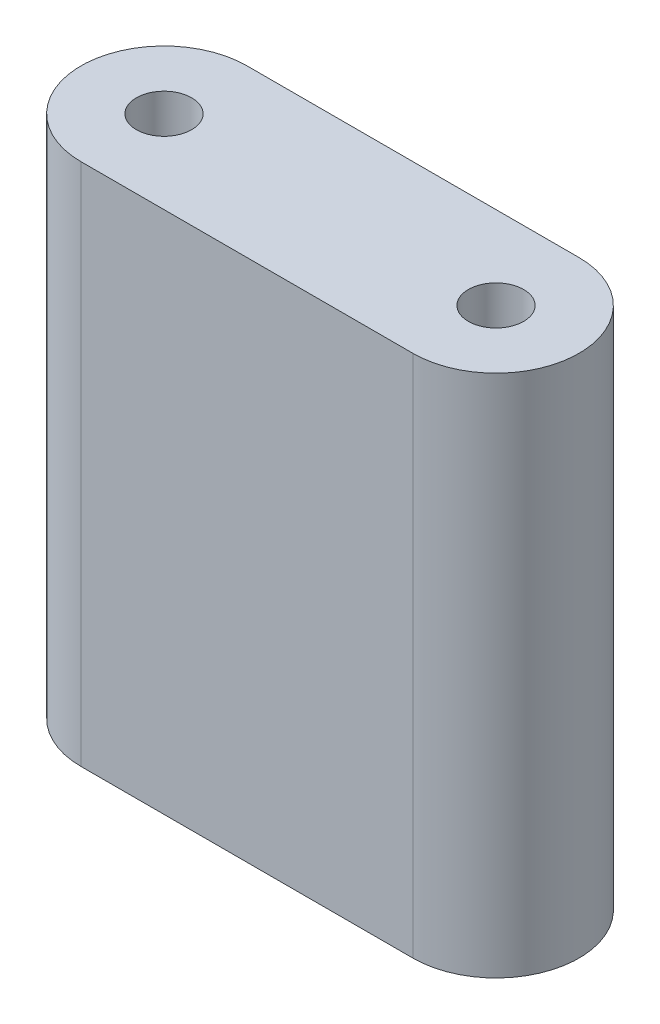
ISO-10303-21;
HEADER;
FILE_DESCRIPTION(('STEP AP214'),'2;1');
FILE_NAME('part.step','',(''),(''),'','','');
FILE_SCHEMA(('AUTOMOTIVE_DESIGN { 1 0 10303 214 1 1 1 1 }'));
ENDSEC;
DATA;
#1=APPLICATION_CONTEXT('core data for automotive mechanical design processes');
#2=APPLICATION_PROTOCOL_DEFINITION('international standard','automotive_design',2000,#1);
#3=PRODUCT_CONTEXT('',#1,'mechanical');
#4=PRODUCT('Part','Part','',(#3));
#5=PRODUCT_RELATED_PRODUCT_CATEGORY('part','',(#4));
#6=PRODUCT_DEFINITION_FORMATION('','',#4);
#7=PRODUCT_DEFINITION_CONTEXT('part definition',#1,'design');
#8=PRODUCT_DEFINITION('design','',#6,#7);
#9=PRODUCT_DEFINITION_SHAPE('','',#8);
#10=(LENGTH_UNIT() NAMED_UNIT(*) SI_UNIT(.MILLI.,.METRE.));
#11=(NAMED_UNIT(*) PLANE_ANGLE_UNIT() SI_UNIT($,.RADIAN.));
#12=(NAMED_UNIT(*) SI_UNIT($,.STERADIAN.) SOLID_ANGLE_UNIT());
#13=UNCERTAINTY_MEASURE_WITH_UNIT(LENGTH_MEASURE(1.E-05),#10,'distance_accuracy_value','');
#14=(GEOMETRIC_REPRESENTATION_CONTEXT(3) GLOBAL_UNCERTAINTY_ASSIGNED_CONTEXT((#13)) GLOBAL_UNIT_ASSIGNED_CONTEXT((#10,
#11,#12)) REPRESENTATION_CONTEXT('',''));
#15=CARTESIAN_POINT('',(0.,0.,0.));
#16=DIRECTION('',(0.,0.,1.));
#17=DIRECTION('',(1.,0.,0.));
#18=AXIS2_PLACEMENT_3D('',#15,#16,#17);
#19=CARTESIAN_POINT('',(-12.,0.,0.));
#20=DIRECTION('',(0.,1.,0.));
#21=DIRECTION('',(0.,0.,1.));
#22=AXIS2_PLACEMENT_3D('',#19,#20,#21);
#23=PLANE('',#22);
#24=CARTESIAN_POINT('',(-12.,0.,0.));
#25=DIRECTION('',(0.,1.,0.));
#26=DIRECTION('',(0.,0.,1.));
#27=AXIS2_PLACEMENT_3D('',#24,#25,#26);
#28=CIRCLE('',#27,6.);
#29=CARTESIAN_POINT('',(-12.,0.,-6.));
#30=VERTEX_POINT('',#29);
#31=CARTESIAN_POINT('',(-12.,0.,6.));
#32=VERTEX_POINT('',#31);
#33=EDGE_CURVE('E297',#30,#32,#28,.T.);
#34=ORIENTED_EDGE('',*,*,#33,.F.);
#35=DIRECTION('',(-1.,0.,0.));
#36=VECTOR('',#35,1.);
#37=CARTESIAN_POINT('',(-12.,0.,-6.));
#38=LINE('',#37,#36);
#39=CARTESIAN_POINT('',(12.,0.,-6.));
#40=VERTEX_POINT('',#39);
#41=EDGE_CURVE('E303',#40,#30,#38,.T.);
#42=ORIENTED_EDGE('',*,*,#41,.F.);
#43=CARTESIAN_POINT('',(12.,0.,0.));
#44=DIRECTION('',(0.,1.,0.));
#45=DIRECTION('',(0.,0.,1.));
#46=AXIS2_PLACEMENT_3D('',#43,#44,#45);
#47=CIRCLE('',#46,6.);
#48=CARTESIAN_POINT('',(12.,0.,6.));
#49=VERTEX_POINT('',#48);
#50=EDGE_CURVE('E319',#49,#40,#47,.T.);
#51=ORIENTED_EDGE('',*,*,#50,.F.);
#52=DIRECTION('',(1.,0.,0.));
#53=VECTOR('',#52,1.);
#54=CARTESIAN_POINT('',(-12.,0.,6.));
#55=LINE('',#54,#53);
#56=EDGE_CURVE('E316',#32,#49,#55,.T.);
#57=ORIENTED_EDGE('',*,*,#56,.F.);
#58=EDGE_LOOP('',(#34,#42,#51,#57));
#59=FACE_BOUND('',#58,.T.);
#60=DIRECTION('',(0.5,0.,-0.866025403784439));
#61=VECTOR('',#60,1.);
#62=CARTESIAN_POINT('',(-15.6661742093541,0.,0.));
#63=LINE('',#62,#61);
#64=CARTESIAN_POINT('',(-15.6661742093541,0.,0.));
#65=VERTEX_POINT('',#64);
#66=CARTESIAN_POINT('',(-13.8330871046771,0.,-3.17500000000001));
#67=VERTEX_POINT('',#66);
#68=EDGE_CURVE('E236',#65,#67,#63,.T.);
#69=ORIENTED_EDGE('',*,*,#68,.F.);
#70=DIRECTION('',(-0.5,0.,-0.866025403784439));
#71=VECTOR('',#70,1.);
#72=CARTESIAN_POINT('',(-13.8330871046771,0.,3.175));
#73=LINE('',#72,#71);
#74=CARTESIAN_POINT('',(-13.8330871046771,0.,3.175));
#75=VERTEX_POINT('',#74);
#76=EDGE_CURVE('E240',#75,#65,#73,.T.);
#77=ORIENTED_EDGE('',*,*,#76,.F.);
#78=DIRECTION('',(-1.,0.,0.));
#79=VECTOR('',#78,1.);
#80=CARTESIAN_POINT('',(-10.1669128953229,0.,3.175));
#81=LINE('',#80,#79);
#82=CARTESIAN_POINT('',(-10.1669128953229,0.,3.175));
#83=VERTEX_POINT('',#82);
#84=EDGE_CURVE('E193',#83,#75,#81,.T.);
#85=ORIENTED_EDGE('',*,*,#84,.F.);
#86=DIRECTION('',(-0.5,0.,0.866025403784439));
#87=VECTOR('',#86,1.);
#88=CARTESIAN_POINT('',(-8.33382579064587,0.,0.));
#89=LINE('',#88,#87);
#90=CARTESIAN_POINT('',(-8.33382579064587,0.,0.));
#91=VERTEX_POINT('',#90);
#92=EDGE_CURVE('E71',#91,#83,#89,.T.);
#93=ORIENTED_EDGE('',*,*,#92,.F.);
#94=DIRECTION('',(0.5,0.,0.866025403784439));
#95=VECTOR('',#94,1.);
#96=CARTESIAN_POINT('',(-10.1669128953229,0.,-3.17500000000001));
#97=LINE('',#96,#95);
#98=CARTESIAN_POINT('',(-10.1669128953229,0.,-3.17500000000001));
#99=VERTEX_POINT('',#98);
#100=EDGE_CURVE('E228',#99,#91,#97,.T.);
#101=ORIENTED_EDGE('',*,*,#100,.F.);
#102=DIRECTION('',(1.,0.,0.));
#103=VECTOR('',#102,1.);
#104=CARTESIAN_POINT('',(-13.8330871046771,0.,-3.17500000000001));
#105=LINE('',#104,#103);
#106=EDGE_CURVE('E232',#67,#99,#105,.T.);
#107=ORIENTED_EDGE('',*,*,#106,.F.);
#108=EDGE_LOOP('',(#69,#77,#85,#93,#101,#107));
#109=FACE_BOUND('',#108,.T.);
#110=DIRECTION('',(1.,0.,0.));
#111=VECTOR('',#110,1.);
#112=CARTESIAN_POINT('',(10.1669128953229,0.,3.175));
#113=LINE('',#112,#111);
#114=CARTESIAN_POINT('',(10.1669128953229,0.,3.175));
#115=VERTEX_POINT('',#114);
#116=CARTESIAN_POINT('',(13.8330871046771,0.,3.175));
#117=VERTEX_POINT('',#116);
#118=EDGE_CURVE('E63',#115,#117,#113,.T.);
#119=ORIENTED_EDGE('',*,*,#118,.T.);
#120=DIRECTION('',(0.5,0.,-0.866025403784439));
#121=VECTOR('',#120,1.);
#122=CARTESIAN_POINT('',(13.8330871046771,0.,3.175));
#123=LINE('',#122,#121);
#124=CARTESIAN_POINT('',(15.6661742093541,0.,0.));
#125=VERTEX_POINT('',#124);
#126=EDGE_CURVE('E211',#117,#125,#123,.T.);
#127=ORIENTED_EDGE('',*,*,#126,.T.);
#128=DIRECTION('',(-0.5,0.,-0.866025403784439));
#129=VECTOR('',#128,1.);
#130=CARTESIAN_POINT('',(15.6661742093541,0.,0.));
#131=LINE('',#130,#129);
#132=CARTESIAN_POINT('',(13.8330871046771,0.,-3.17500000000001));
#133=VERTEX_POINT('',#132);
#134=EDGE_CURVE('E215',#125,#133,#131,.T.);
#135=ORIENTED_EDGE('',*,*,#134,.T.);
#136=DIRECTION('',(-1.,0.,0.));
#137=VECTOR('',#136,1.);
#138=CARTESIAN_POINT('',(13.8330871046771,0.,-3.17500000000001));
#139=LINE('',#138,#137);
#140=CARTESIAN_POINT('',(10.1669128953229,0.,-3.17500000000001));
#141=VERTEX_POINT('',#140);
#142=EDGE_CURVE('E219',#133,#141,#139,.T.);
#143=ORIENTED_EDGE('',*,*,#142,.T.);
#144=DIRECTION('',(-0.5,0.,0.866025403784439));
#145=VECTOR('',#144,1.);
#146=CARTESIAN_POINT('',(10.1669128953229,0.,-3.17500000000001));
#147=LINE('',#146,#145);
#148=CARTESIAN_POINT('',(8.33382579064587,0.,0.));
#149=VERTEX_POINT('',#148);
#150=EDGE_CURVE('E173',#141,#149,#147,.T.);
#151=ORIENTED_EDGE('',*,*,#150,.T.);
#152=DIRECTION('',(0.5,0.,0.866025403784439));
#153=VECTOR('',#152,1.);
#154=CARTESIAN_POINT('',(8.33382579064587,0.,0.));
#155=LINE('',#154,#153);
#156=EDGE_CURVE('E167',#149,#115,#155,.T.);
#157=ORIENTED_EDGE('',*,*,#156,.T.);
#158=EDGE_LOOP('',(#119,#127,#135,#143,#151,#157));
#159=FACE_BOUND('',#158,.T.);
#160=ADVANCED_FACE('F45',(#59,#109,#159),#23,.F.);
#161=CARTESIAN_POINT('',(-12.,37.86,0.));
#162=DIRECTION('',(0.,1.,0.));
#163=DIRECTION('',(0.,0.,1.));
#164=AXIS2_PLACEMENT_3D('',#161,#162,#163);
#165=PLANE('',#164);
#166=CARTESIAN_POINT('',(-12.,37.86,0.));
#167=DIRECTION('',(0.,1.,0.));
#168=DIRECTION('',(0.,0.,1.));
#169=AXIS2_PLACEMENT_3D('',#166,#167,#168);
#170=CIRCLE('',#169,2.);
#171=CARTESIAN_POINT('',(-12.,37.86,2.));
#172=VERTEX_POINT('',#171);
#173=EDGE_CURVE('E293',#172,#172,#170,.T.);
#174=ORIENTED_EDGE('',*,*,#173,.F.);
#175=EDGE_LOOP('',(#174));
#176=FACE_BOUND('',#175,.T.);
#177=CARTESIAN_POINT('',(-12.,37.86,0.));
#178=DIRECTION('',(0.,1.,0.));
#179=DIRECTION('',(0.,0.,1.));
#180=AXIS2_PLACEMENT_3D('',#177,#178,#179);
#181=CIRCLE('',#180,6.);
#182=CARTESIAN_POINT('',(-12.,37.86,-6.));
#183=VERTEX_POINT('',#182);
#184=CARTESIAN_POINT('',(-12.,37.86,6.));
#185=VERTEX_POINT('',#184);
#186=EDGE_CURVE('E298',#183,#185,#181,.T.);
#187=ORIENTED_EDGE('',*,*,#186,.T.);
#188=DIRECTION('',(1.,0.,0.));
#189=VECTOR('',#188,1.);
#190=CARTESIAN_POINT('',(-12.,37.86,6.));
#191=LINE('',#190,#189);
#192=CARTESIAN_POINT('',(12.,37.86,6.));
#193=VERTEX_POINT('',#192);
#194=EDGE_CURVE('E302',#185,#193,#191,.T.);
#195=ORIENTED_EDGE('',*,*,#194,.T.);
#196=CARTESIAN_POINT('',(12.,37.86,0.));
#197=DIRECTION('',(0.,1.,0.));
#198=DIRECTION('',(0.,0.,1.));
#199=AXIS2_PLACEMENT_3D('',#196,#197,#198);
#200=CIRCLE('',#199,6.);
#201=CARTESIAN_POINT('',(12.,37.86,-6.));
#202=VERTEX_POINT('',#201);
#203=EDGE_CURVE('E306',#193,#202,#200,.T.);
#204=ORIENTED_EDGE('',*,*,#203,.T.);
#205=DIRECTION('',(-1.,0.,0.));
#206=VECTOR('',#205,1.);
#207=CARTESIAN_POINT('',(-12.,37.86,-6.));
#208=LINE('',#207,#206);
#209=EDGE_CURVE('E309',#202,#183,#208,.T.);
#210=ORIENTED_EDGE('',*,*,#209,.T.);
#211=EDGE_LOOP('',(#187,#195,#204,#210));
#212=FACE_BOUND('',#211,.T.);
#213=CARTESIAN_POINT('',(12.,37.86,0.));
#214=DIRECTION('',(0.,1.,0.));
#215=DIRECTION('',(0.,0.,1.));
#216=AXIS2_PLACEMENT_3D('',#213,#214,#215);
#217=CIRCLE('',#216,2.);
#218=CARTESIAN_POINT('',(12.,37.86,2.));
#219=VERTEX_POINT('',#218);
#220=EDGE_CURVE('E289',#219,#219,#217,.T.);
#221=ORIENTED_EDGE('',*,*,#220,.F.);
#222=EDGE_LOOP('',(#221));
#223=FACE_BOUND('',#222,.T.);
#224=ADVANCED_FACE('F348',(#176,#212,#223),#165,.T.);
#225=CARTESIAN_POINT('',(-12.,37.86,0.));
#226=DIRECTION('',(0.,-1.,0.));
#227=DIRECTION('',(0.,0.,-1.));
#228=AXIS2_PLACEMENT_3D('',#225,#226,#227);
#229=CYLINDRICAL_SURFACE('',#228,6.);
#230=ORIENTED_EDGE('',*,*,#33,.T.);
#231=DIRECTION('',(0.,-1.,0.));
#232=VECTOR('',#231,1.);
#233=CARTESIAN_POINT('',(-12.,37.86,6.));
#234=LINE('',#233,#232);
#235=EDGE_CURVE('E12',#185,#32,#234,.T.);
#236=ORIENTED_EDGE('',*,*,#235,.F.);
#237=ORIENTED_EDGE('',*,*,#186,.F.);
#238=DIRECTION('',(0.,-1.,0.));
#239=VECTOR('',#238,1.);
#240=CARTESIAN_POINT('',(-12.,37.86,-6.));
#241=LINE('',#240,#239);
#242=EDGE_CURVE('E312',#183,#30,#241,.T.);
#243=ORIENTED_EDGE('',*,*,#242,.T.);
#244=EDGE_LOOP('',(#230,#236,#237,#243));
#245=FACE_BOUND('',#244,.T.);
#246=ADVANCED_FACE('F47',(#245),#229,.T.);
#247=CARTESIAN_POINT('',(-12.,37.86,6.));
#248=DIRECTION('',(0.,0.,-1.));
#249=DIRECTION('',(-1.,0.,0.));
#250=AXIS2_PLACEMENT_3D('',#247,#248,#249);
#251=PLANE('',#250);
#252=ORIENTED_EDGE('',*,*,#56,.T.);
#253=DIRECTION('',(0.,-1.,0.));
#254=VECTOR('',#253,1.);
#255=CARTESIAN_POINT('',(12.,37.86,6.));
#256=LINE('',#255,#254);
#257=EDGE_CURVE('E55',#193,#49,#256,.T.);
#258=ORIENTED_EDGE('',*,*,#257,.F.);
#259=ORIENTED_EDGE('',*,*,#194,.F.);
#260=ORIENTED_EDGE('',*,*,#235,.T.);
#261=EDGE_LOOP('',(#252,#258,#259,#260));
#262=FACE_BOUND('',#261,.T.);
#263=ADVANCED_FACE('F379',(#262),#251,.F.);
#264=CARTESIAN_POINT('',(12.,37.86,0.));
#265=DIRECTION('',(0.,-1.,0.));
#266=DIRECTION('',(0.,0.,-1.));
#267=AXIS2_PLACEMENT_3D('',#264,#265,#266);
#268=CYLINDRICAL_SURFACE('',#267,6.);
#269=ORIENTED_EDGE('',*,*,#50,.T.);
#270=DIRECTION('',(0.,-1.,0.));
#271=VECTOR('',#270,1.);
#272=CARTESIAN_POINT('',(12.,37.86,-6.));
#273=LINE('',#272,#271);
#274=EDGE_CURVE('E327',#202,#40,#273,.T.);
#275=ORIENTED_EDGE('',*,*,#274,.F.);
#276=ORIENTED_EDGE('',*,*,#203,.F.);
#277=ORIENTED_EDGE('',*,*,#257,.T.);
#278=EDGE_LOOP('',(#269,#275,#276,#277));
#279=FACE_BOUND('',#278,.T.);
#280=ADVANCED_FACE('F376',(#279),#268,.T.);
#281=CARTESIAN_POINT('',(-12.,37.86,-6.));
#282=DIRECTION('',(0.,0.,1.));
#283=DIRECTION('',(1.,0.,0.));
#284=AXIS2_PLACEMENT_3D('',#281,#282,#283);
#285=PLANE('',#284);
#286=ORIENTED_EDGE('',*,*,#41,.T.);
#287=ORIENTED_EDGE('',*,*,#242,.F.);
#288=ORIENTED_EDGE('',*,*,#209,.F.);
#289=ORIENTED_EDGE('',*,*,#274,.T.);
#290=EDGE_LOOP('',(#286,#287,#288,#289));
#291=FACE_BOUND('',#290,.T.);
#292=ADVANCED_FACE('F344',(#291),#285,.F.);
#293=CARTESIAN_POINT('',(-12.,37.86,0.));
#294=DIRECTION('',(0.,-1.,0.));
#295=DIRECTION('',(0.,0.,-1.));
#296=AXIS2_PLACEMENT_3D('',#293,#294,#295);
#297=CYLINDRICAL_SURFACE('',#296,2.);
#298=CARTESIAN_POINT('',(-12.,28.86,0.));
#299=DIRECTION('',(0.,1.,0.));
#300=DIRECTION('',(0.,0.,1.));
#301=AXIS2_PLACEMENT_3D('',#298,#299,#300);
#302=CIRCLE('',#301,2.);
#303=CARTESIAN_POINT('',(-12.,28.86,2.));
#304=VERTEX_POINT('',#303);
#305=EDGE_CURVE('E288',#304,#304,#302,.T.);
#306=ORIENTED_EDGE('',*,*,#305,.F.);
#307=EDGE_LOOP('',(#306));
#308=FACE_BOUND('',#307,.T.);
#309=ORIENTED_EDGE('',*,*,#173,.T.);
#310=EDGE_LOOP('',(#309));
#311=FACE_BOUND('',#310,.T.);
#312=ADVANCED_FACE('F340',(#308,#311),#297,.F.);
#313=CARTESIAN_POINT('',(12.,37.86,0.));
#314=DIRECTION('',(0.,-1.,0.));
#315=DIRECTION('',(0.,0.,-1.));
#316=AXIS2_PLACEMENT_3D('',#313,#314,#315);
#317=CYLINDRICAL_SURFACE('',#316,2.);
#318=CARTESIAN_POINT('',(12.,28.86,0.));
#319=DIRECTION('',(0.,1.,0.));
#320=DIRECTION('',(0.,0.,1.));
#321=AXIS2_PLACEMENT_3D('',#318,#319,#320);
#322=CIRCLE('',#321,2.);
#323=CARTESIAN_POINT('',(12.,28.86,2.));
#324=VERTEX_POINT('',#323);
#325=EDGE_CURVE('E49',#324,#324,#322,.T.);
#326=ORIENTED_EDGE('',*,*,#325,.F.);
#327=EDGE_LOOP('',(#326));
#328=FACE_BOUND('',#327,.T.);
#329=ORIENTED_EDGE('',*,*,#220,.T.);
#330=EDGE_LOOP('',(#329));
#331=FACE_BOUND('',#330,.T.);
#332=ADVANCED_FACE('F343',(#328,#331),#317,.F.);
#333=CARTESIAN_POINT('',(-12.,28.86,0.));
#334=DIRECTION('',(0.,1.,0.));
#335=DIRECTION('',(0.,0.,1.));
#336=AXIS2_PLACEMENT_3D('',#333,#334,#335);
#337=PLANE('',#336);
#338=ORIENTED_EDGE('',*,*,#305,.T.);
#339=EDGE_LOOP('',(#338));
#340=FACE_BOUND('',#339,.T.);
#341=DIRECTION('',(-1.,0.,0.));
#342=VECTOR('',#341,1.);
#343=CARTESIAN_POINT('',(-10.1669128953229,28.86,3.175));
#344=LINE('',#343,#342);
#345=CARTESIAN_POINT('',(-10.1669128953229,28.86,3.175));
#346=VERTEX_POINT('',#345);
#347=CARTESIAN_POINT('',(-13.8330871046771,28.86,3.175));
#348=VERTEX_POINT('',#347);
#349=EDGE_CURVE('E251',#346,#348,#344,.T.);
#350=ORIENTED_EDGE('',*,*,#349,.T.);
#351=DIRECTION('',(-0.5,0.,-0.866025403784439));
#352=VECTOR('',#351,1.);
#353=CARTESIAN_POINT('',(-13.8330871046771,28.86,3.175));
#354=LINE('',#353,#352);
#355=CARTESIAN_POINT('',(-15.6661742093541,28.86,0.));
#356=VERTEX_POINT('',#355);
#357=EDGE_CURVE('E227',#348,#356,#354,.T.);
#358=ORIENTED_EDGE('',*,*,#357,.T.);
#359=DIRECTION('',(0.5,0.,-0.866025403784439));
#360=VECTOR('',#359,1.);
#361=CARTESIAN_POINT('',(-15.6661742093541,28.86,0.));
#362=LINE('',#361,#360);
#363=CARTESIAN_POINT('',(-13.8330871046771,28.86,-3.17500000000001));
#364=VERTEX_POINT('',#363);
#365=EDGE_CURVE('E272',#356,#364,#362,.T.);
#366=ORIENTED_EDGE('',*,*,#365,.T.);
#367=DIRECTION('',(1.,0.,0.));
#368=VECTOR('',#367,1.);
#369=CARTESIAN_POINT('',(-13.8330871046771,28.86,-3.17500000000001));
#370=LINE('',#369,#368);
#371=CARTESIAN_POINT('',(-10.1669128953229,28.86,-3.17500000000001));
#372=VERTEX_POINT('',#371);
#373=EDGE_CURVE('E267',#364,#372,#370,.T.);
#374=ORIENTED_EDGE('',*,*,#373,.T.);
#375=DIRECTION('',(0.5,0.,0.866025403784439));
#376=VECTOR('',#375,1.);
#377=CARTESIAN_POINT('',(-10.1669128953229,28.86,-3.17500000000001));
#378=LINE('',#377,#376);
#379=CARTESIAN_POINT('',(-8.33382579064587,28.86,0.));
#380=VERTEX_POINT('',#379);
#381=EDGE_CURVE('E262',#372,#380,#378,.T.);
#382=ORIENTED_EDGE('',*,*,#381,.T.);
#383=DIRECTION('',(-0.5,0.,0.866025403784439));
#384=VECTOR('',#383,1.);
#385=CARTESIAN_POINT('',(-8.33382579064587,28.86,0.));
#386=LINE('',#385,#384);
#387=EDGE_CURVE('E257',#380,#346,#386,.T.);
#388=ORIENTED_EDGE('',*,*,#387,.T.);
#389=EDGE_LOOP('',(#350,#358,#366,#374,#382,#388));
#390=FACE_BOUND('',#389,.T.);
#391=ADVANCED_FACE('F337',(#340,#390),#337,.F.);
#392=CARTESIAN_POINT('',(-13.8330871046771,47.5597852209899,3.175));
#393=DIRECTION('',(-0.866025403784439,0.,0.5));
#394=DIRECTION('',(0.5,0.,0.866025403784439));
#395=AXIS2_PLACEMENT_3D('',#392,#393,#394);
#396=PLANE('',#395);
#397=DIRECTION('',(0.,-1.,0.));
#398=VECTOR('',#397,1.);
#399=CARTESIAN_POINT('',(-13.8330871046771,47.5597852209899,3.175));
#400=LINE('',#399,#398);
#401=EDGE_CURVE('E255',#348,#75,#400,.T.);
#402=ORIENTED_EDGE('',*,*,#401,.T.);
#403=ORIENTED_EDGE('',*,*,#76,.T.);
#404=DIRECTION('',(0.,-1.,0.));
#405=VECTOR('',#404,1.);
#406=CARTESIAN_POINT('',(-15.6661742093541,47.5597852209899,0.));
#407=LINE('',#406,#405);
#408=EDGE_CURVE('E250',#356,#65,#407,.T.);
#409=ORIENTED_EDGE('',*,*,#408,.F.);
#410=ORIENTED_EDGE('',*,*,#357,.F.);
#411=EDGE_LOOP('',(#402,#403,#409,#410));
#412=FACE_BOUND('',#411,.T.);
#413=ADVANCED_FACE('F363',(#412),#396,.F.);
#414=CARTESIAN_POINT('',(-15.6661742093541,47.5597852209899,0.));
#415=DIRECTION('',(-0.866025403784439,0.,-0.5));
#416=DIRECTION('',(-0.5,0.,0.866025403784439));
#417=AXIS2_PLACEMENT_3D('',#414,#415,#416);
#418=PLANE('',#417);
#419=ORIENTED_EDGE('',*,*,#408,.T.);
#420=ORIENTED_EDGE('',*,*,#68,.T.);
#421=DIRECTION('',(0.,-1.,0.));
#422=VECTOR('',#421,1.);
#423=CARTESIAN_POINT('',(-13.8330871046771,47.5597852209899,-3.17500000000001));
#424=LINE('',#423,#422);
#425=EDGE_CURVE('E271',#364,#67,#424,.T.);
#426=ORIENTED_EDGE('',*,*,#425,.F.);
#427=ORIENTED_EDGE('',*,*,#365,.F.);
#428=EDGE_LOOP('',(#419,#420,#426,#427));
#429=FACE_BOUND('',#428,.T.);
#430=ADVANCED_FACE('F458',(#429),#418,.F.);
#431=CARTESIAN_POINT('',(-13.8330871046771,47.5597852209899,-3.17500000000001));
#432=DIRECTION('',(0.,0.,-1.));
#433=DIRECTION('',(-1.,0.,0.));
#434=AXIS2_PLACEMENT_3D('',#431,#432,#433);
#435=PLANE('',#434);
#436=ORIENTED_EDGE('',*,*,#425,.T.);
#437=ORIENTED_EDGE('',*,*,#106,.T.);
#438=DIRECTION('',(0.,-1.,0.));
#439=VECTOR('',#438,1.);
#440=CARTESIAN_POINT('',(-10.1669128953229,47.5597852209899,-3.17500000000001));
#441=LINE('',#440,#439);
#442=EDGE_CURVE('E266',#372,#99,#441,.T.);
#443=ORIENTED_EDGE('',*,*,#442,.F.);
#444=ORIENTED_EDGE('',*,*,#373,.F.);
#445=EDGE_LOOP('',(#436,#437,#443,#444));
#446=FACE_BOUND('',#445,.T.);
#447=ADVANCED_FACE('F469',(#446),#435,.F.);
#448=CARTESIAN_POINT('',(-10.1669128953229,47.5597852209899,-3.17500000000001));
#449=DIRECTION('',(0.866025403784439,0.,-0.5));
#450=DIRECTION('',(-0.5,0.,-0.866025403784439));
#451=AXIS2_PLACEMENT_3D('',#448,#449,#450);
#452=PLANE('',#451);
#453=ORIENTED_EDGE('',*,*,#442,.T.);
#454=ORIENTED_EDGE('',*,*,#100,.T.);
#455=DIRECTION('',(0.,-1.,0.));
#456=VECTOR('',#455,1.);
#457=CARTESIAN_POINT('',(-8.33382579064587,47.5597852209899,0.));
#458=LINE('',#457,#456);
#459=EDGE_CURVE('E261',#380,#91,#458,.T.);
#460=ORIENTED_EDGE('',*,*,#459,.F.);
#461=ORIENTED_EDGE('',*,*,#381,.F.);
#462=EDGE_LOOP('',(#453,#454,#460,#461));
#463=FACE_BOUND('',#462,.T.);
#464=ADVANCED_FACE('F480',(#463),#452,.F.);
#465=CARTESIAN_POINT('',(-8.33382579064587,47.5597852209899,0.));
#466=DIRECTION('',(0.866025403784439,0.,0.5));
#467=DIRECTION('',(0.5,0.,-0.866025403784439));
#468=AXIS2_PLACEMENT_3D('',#465,#466,#467);
#469=PLANE('',#468);
#470=ORIENTED_EDGE('',*,*,#459,.T.);
#471=ORIENTED_EDGE('',*,*,#92,.T.);
#472=DIRECTION('',(0.,-1.,0.));
#473=VECTOR('',#472,1.);
#474=CARTESIAN_POINT('',(-10.1669128953229,47.5597852209899,3.175));
#475=LINE('',#474,#473);
#476=EDGE_CURVE('E256',#346,#83,#475,.T.);
#477=ORIENTED_EDGE('',*,*,#476,.F.);
#478=ORIENTED_EDGE('',*,*,#387,.F.);
#479=EDGE_LOOP('',(#470,#471,#477,#478));
#480=FACE_BOUND('',#479,.T.);
#481=ADVANCED_FACE('F491',(#480),#469,.F.);
#482=CARTESIAN_POINT('',(-10.1669128953229,47.5597852209899,3.175));
#483=DIRECTION('',(0.,0.,1.));
#484=DIRECTION('',(1.,0.,0.));
#485=AXIS2_PLACEMENT_3D('',#482,#483,#484);
#486=PLANE('',#485);
#487=ORIENTED_EDGE('',*,*,#476,.T.);
#488=ORIENTED_EDGE('',*,*,#84,.T.);
#489=ORIENTED_EDGE('',*,*,#401,.F.);
#490=ORIENTED_EDGE('',*,*,#349,.F.);
#491=EDGE_LOOP('',(#487,#488,#489,#490));
#492=FACE_BOUND('',#491,.T.);
#493=ADVANCED_FACE('F502',(#492),#486,.F.);
#494=CARTESIAN_POINT('',(10.1669128953229,47.5597852209899,3.175));
#495=DIRECTION('',(0.,0.,-1.));
#496=DIRECTION('',(-1.,0.,0.));
#497=AXIS2_PLACEMENT_3D('',#494,#495,#496);
#498=PLANE('',#497);
#499=DIRECTION('',(1.,0.,0.));
#500=VECTOR('',#499,1.);
#501=CARTESIAN_POINT('',(10.1669128953229,28.86,3.175));
#502=LINE('',#501,#500);
#503=CARTESIAN_POINT('',(10.1669128953229,28.86,3.175));
#504=VERTEX_POINT('',#503);
#505=CARTESIAN_POINT('',(13.8330871046771,28.86,3.175));
#506=VERTEX_POINT('',#505);
#507=EDGE_CURVE('E181',#504,#506,#502,.T.);
#508=ORIENTED_EDGE('',*,*,#507,.T.);
#509=DIRECTION('',(0.,-1.,0.));
#510=VECTOR('',#509,1.);
#511=CARTESIAN_POINT('',(13.8330871046771,47.5597852209899,3.175));
#512=LINE('',#511,#510);
#513=EDGE_CURVE('E208',#506,#117,#512,.T.);
#514=ORIENTED_EDGE('',*,*,#513,.T.);
#515=ORIENTED_EDGE('',*,*,#118,.F.);
#516=DIRECTION('',(0.,-1.,0.));
#517=VECTOR('',#516,1.);
#518=CARTESIAN_POINT('',(10.1669128953229,47.5597852209899,3.175));
#519=LINE('',#518,#517);
#520=EDGE_CURVE('E222',#504,#115,#519,.T.);
#521=ORIENTED_EDGE('',*,*,#520,.F.);
#522=EDGE_LOOP('',(#508,#514,#515,#521));
#523=FACE_BOUND('',#522,.T.);
#524=ADVANCED_FACE('F512',(#523),#498,.T.);
#525=CARTESIAN_POINT('',(13.8330871046771,47.5597852209899,3.175));
#526=DIRECTION('',(-0.866025403784439,0.,-0.5));
#527=DIRECTION('',(-0.5,0.,0.866025403784439));
#528=AXIS2_PLACEMENT_3D('',#525,#526,#527);
#529=PLANE('',#528);
#530=DIRECTION('',(0.5,0.,-0.866025403784439));
#531=VECTOR('',#530,1.);
#532=CARTESIAN_POINT('',(13.8330871046771,28.86,3.175));
#533=LINE('',#532,#531);
#534=CARTESIAN_POINT('',(15.6661742093541,28.86,0.));
#535=VERTEX_POINT('',#534);
#536=EDGE_CURVE('E202',#506,#535,#533,.T.);
#537=ORIENTED_EDGE('',*,*,#536,.T.);
#538=DIRECTION('',(0.,-1.,0.));
#539=VECTOR('',#538,1.);
#540=CARTESIAN_POINT('',(15.6661742093541,47.5597852209899,0.));
#541=LINE('',#540,#539);
#542=EDGE_CURVE('E212',#535,#125,#541,.T.);
#543=ORIENTED_EDGE('',*,*,#542,.T.);
#544=ORIENTED_EDGE('',*,*,#126,.F.);
#545=ORIENTED_EDGE('',*,*,#513,.F.);
#546=EDGE_LOOP('',(#537,#543,#544,#545));
#547=FACE_BOUND('',#546,.T.);
#548=ADVANCED_FACE('F527',(#547),#529,.T.);
#549=CARTESIAN_POINT('',(15.6661742093541,47.5597852209899,0.));
#550=DIRECTION('',(-0.866025403784439,0.,0.5));
#551=DIRECTION('',(0.5,0.,0.866025403784439));
#552=AXIS2_PLACEMENT_3D('',#549,#550,#551);
#553=PLANE('',#552);
#554=DIRECTION('',(-0.5,0.,-0.866025403784439));
#555=VECTOR('',#554,1.);
#556=CARTESIAN_POINT('',(15.6661742093541,28.86,0.));
#557=LINE('',#556,#555);
#558=CARTESIAN_POINT('',(13.8330871046771,28.86,-3.17500000000001));
#559=VERTEX_POINT('',#558);
#560=EDGE_CURVE('E194',#535,#559,#557,.T.);
#561=ORIENTED_EDGE('',*,*,#560,.T.);
#562=DIRECTION('',(0.,-1.,0.));
#563=VECTOR('',#562,1.);
#564=CARTESIAN_POINT('',(13.8330871046771,47.5597852209899,-3.17500000000001));
#565=LINE('',#564,#563);
#566=EDGE_CURVE('E216',#559,#133,#565,.T.);
#567=ORIENTED_EDGE('',*,*,#566,.T.);
#568=ORIENTED_EDGE('',*,*,#134,.F.);
#569=ORIENTED_EDGE('',*,*,#542,.F.);
#570=EDGE_LOOP('',(#561,#567,#568,#569));
#571=FACE_BOUND('',#570,.T.);
#572=ADVANCED_FACE('F537',(#571),#553,.T.);
#573=CARTESIAN_POINT('',(13.8330871046771,47.5597852209899,-3.17500000000001));
#574=DIRECTION('',(0.,0.,1.));
#575=DIRECTION('',(1.,0.,0.));
#576=AXIS2_PLACEMENT_3D('',#573,#574,#575);
#577=PLANE('',#576);
#578=DIRECTION('',(-1.,0.,0.));
#579=VECTOR('',#578,1.);
#580=CARTESIAN_POINT('',(13.8330871046771,28.86,-3.17500000000001));
#581=LINE('',#580,#579);
#582=CARTESIAN_POINT('',(10.1669128953229,28.86,-3.17500000000001));
#583=VERTEX_POINT('',#582);
#584=EDGE_CURVE('E188',#559,#583,#581,.T.);
#585=ORIENTED_EDGE('',*,*,#584,.T.);
#586=DIRECTION('',(0.,-1.,0.));
#587=VECTOR('',#586,1.);
#588=CARTESIAN_POINT('',(10.1669128953229,47.5597852209899,-3.17500000000001));
#589=LINE('',#588,#587);
#590=EDGE_CURVE('E185',#583,#141,#589,.T.);
#591=ORIENTED_EDGE('',*,*,#590,.T.);
#592=ORIENTED_EDGE('',*,*,#142,.F.);
#593=ORIENTED_EDGE('',*,*,#566,.F.);
#594=EDGE_LOOP('',(#585,#591,#592,#593));
#595=FACE_BOUND('',#594,.T.);
#596=ADVANCED_FACE('F548',(#595),#577,.T.);
#597=CARTESIAN_POINT('',(10.1669128953229,47.5597852209899,-3.17500000000001));
#598=DIRECTION('',(0.866025403784439,0.,0.5));
#599=DIRECTION('',(0.5,0.,-0.866025403784439));
#600=AXIS2_PLACEMENT_3D('',#597,#598,#599);
#601=PLANE('',#600);
#602=DIRECTION('',(-0.5,0.,0.866025403784439));
#603=VECTOR('',#602,1.);
#604=CARTESIAN_POINT('',(10.1669128953229,28.86,-3.17500000000001));
#605=LINE('',#604,#603);
#606=CARTESIAN_POINT('',(8.33382579064587,28.86,0.));
#607=VERTEX_POINT('',#606);
#608=EDGE_CURVE('E178',#583,#607,#605,.T.);
#609=ORIENTED_EDGE('',*,*,#608,.T.);
#610=DIRECTION('',(0.,-1.,0.));
#611=VECTOR('',#610,1.);
#612=CARTESIAN_POINT('',(8.33382579064587,47.5597852209899,0.));
#613=LINE('',#612,#611);
#614=EDGE_CURVE('E162',#607,#149,#613,.T.);
#615=ORIENTED_EDGE('',*,*,#614,.T.);
#616=ORIENTED_EDGE('',*,*,#150,.F.);
#617=ORIENTED_EDGE('',*,*,#590,.F.);
#618=EDGE_LOOP('',(#609,#615,#616,#617));
#619=FACE_BOUND('',#618,.T.);
#620=ADVANCED_FACE('F184',(#619),#601,.T.);
#621=CARTESIAN_POINT('',(8.33382579064587,47.5597852209899,0.));
#622=DIRECTION('',(0.866025403784439,0.,-0.5));
#623=DIRECTION('',(-0.5,0.,-0.866025403784439));
#624=AXIS2_PLACEMENT_3D('',#621,#622,#623);
#625=PLANE('',#624);
#626=DIRECTION('',(0.5,0.,0.866025403784439));
#627=VECTOR('',#626,1.);
#628=CARTESIAN_POINT('',(8.33382579064587,28.86,0.));
#629=LINE('',#628,#627);
#630=EDGE_CURVE('E165',#607,#504,#629,.T.);
#631=ORIENTED_EDGE('',*,*,#630,.T.);
#632=ORIENTED_EDGE('',*,*,#520,.T.);
#633=ORIENTED_EDGE('',*,*,#156,.F.);
#634=ORIENTED_EDGE('',*,*,#614,.F.);
#635=EDGE_LOOP('',(#631,#632,#633,#634));
#636=FACE_BOUND('',#635,.T.);
#637=ADVANCED_FACE('F164',(#636),#625,.T.);
#638=CARTESIAN_POINT('',(-12.,28.86,0.));
#639=DIRECTION('',(0.,1.,0.));
#640=DIRECTION('',(0.,0.,1.));
#641=AXIS2_PLACEMENT_3D('',#638,#639,#640);
#642=PLANE('',#641);
#643=ORIENTED_EDGE('',*,*,#325,.T.);
#644=EDGE_LOOP('',(#643));
#645=FACE_BOUND('',#644,.T.);
#646=ORIENTED_EDGE('',*,*,#630,.F.);
#647=ORIENTED_EDGE('',*,*,#608,.F.);
#648=ORIENTED_EDGE('',*,*,#584,.F.);
#649=ORIENTED_EDGE('',*,*,#560,.F.);
#650=ORIENTED_EDGE('',*,*,#536,.F.);
#651=ORIENTED_EDGE('',*,*,#507,.F.);
#652=EDGE_LOOP('',(#646,#647,#648,#649,#650,#651));
#653=FACE_BOUND('',#652,.T.);
#654=ADVANCED_FACE('F177',(#645,#653),#642,.F.);
#655=CLOSED_SHELL('',(#160,#224,#246,#263,#280,#292,#312,#332,#391,#413,#430,#447,#464,#481,
#493,#524,#548,#572,#596,#620,#637,#654));
#656=MANIFOLD_SOLID_BREP('B2',#655);
#657=ADVANCED_BREP_SHAPE_REPRESENTATION('',(#18,#656),#14);
#658=SHAPE_DEFINITION_REPRESENTATION(#9,#657);
ENDSEC;
END-ISO-10303-21;
